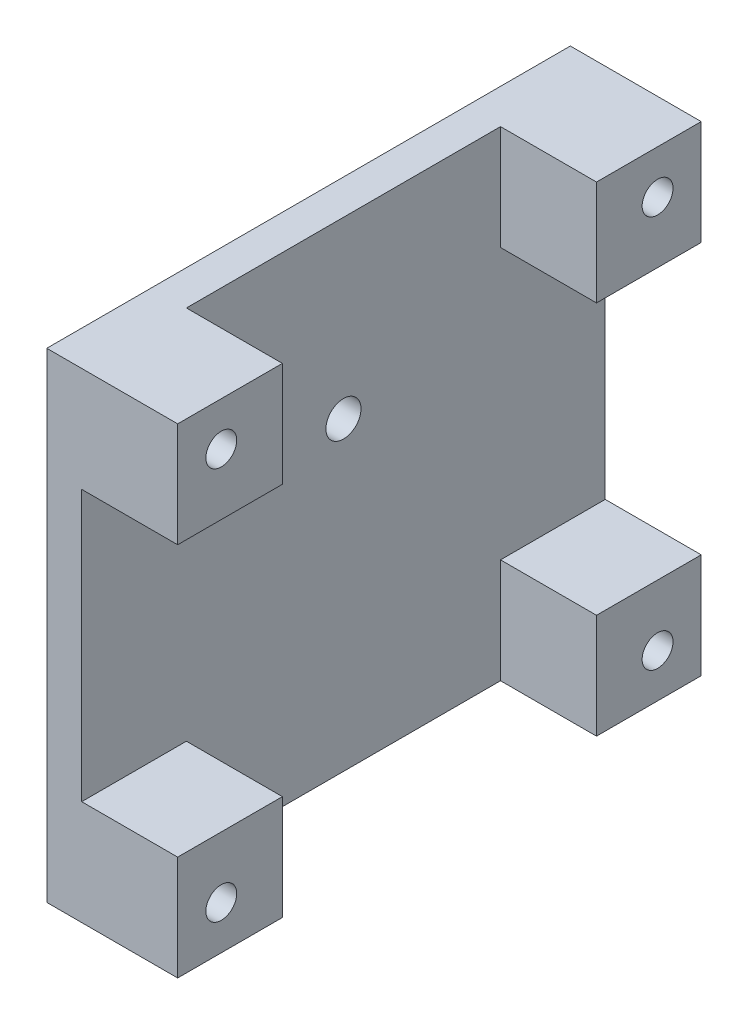
ISO-10303-21;
HEADER;
FILE_DESCRIPTION(('STEP AP214'),'2;1');
FILE_NAME('part.step','',(''),(''),'','','');
FILE_SCHEMA(('AUTOMOTIVE_DESIGN { 1 0 10303 214 1 1 1 1 }'));
ENDSEC;
DATA;
#1=APPLICATION_CONTEXT('core data for automotive mechanical design processes');
#2=APPLICATION_PROTOCOL_DEFINITION('international standard','automotive_design',2000,#1);
#3=PRODUCT_CONTEXT('',#1,'mechanical');
#4=PRODUCT('Part','Part','',(#3));
#5=PRODUCT_RELATED_PRODUCT_CATEGORY('part','',(#4));
#6=PRODUCT_DEFINITION_FORMATION('','',#4);
#7=PRODUCT_DEFINITION_CONTEXT('part definition',#1,'design');
#8=PRODUCT_DEFINITION('design','',#6,#7);
#9=PRODUCT_DEFINITION_SHAPE('','',#8);
#10=(LENGTH_UNIT() NAMED_UNIT(*) SI_UNIT(.MILLI.,.METRE.));
#11=(NAMED_UNIT(*) PLANE_ANGLE_UNIT() SI_UNIT($,.RADIAN.));
#12=(NAMED_UNIT(*) SI_UNIT($,.STERADIAN.) SOLID_ANGLE_UNIT());
#13=UNCERTAINTY_MEASURE_WITH_UNIT(LENGTH_MEASURE(1.E-05),#10,'distance_accuracy_value','');
#14=(GEOMETRIC_REPRESENTATION_CONTEXT(3) GLOBAL_UNCERTAINTY_ASSIGNED_CONTEXT((#13)) GLOBAL_UNIT_ASSIGNED_CONTEXT((#10,
#11,#12)) REPRESENTATION_CONTEXT('',''));
#15=CARTESIAN_POINT('',(0.,0.,0.));
#16=DIRECTION('',(0.,0.,1.));
#17=DIRECTION('',(1.,0.,0.));
#18=AXIS2_PLACEMENT_3D('',#15,#16,#17);
#19=CARTESIAN_POINT('',(19.05,0.,0.));
#20=DIRECTION('',(-1.,0.,0.));
#21=DIRECTION('',(0.,0.,1.));
#22=AXIS2_PLACEMENT_3D('',#19,#20,#21);
#23=PLANE('',#22);
#24=CARTESIAN_POINT('',(19.05,28.575,-31.75));
#25=DIRECTION('',(-1.,0.,0.));
#26=DIRECTION('',(0.,0.,1.));
#27=AXIS2_PLACEMENT_3D('',#24,#25,#26);
#28=CIRCLE('',#27,2.24789999999999);
#29=CARTESIAN_POINT('',(19.05,28.575,-29.5021));
#30=VERTEX_POINT('',#29);
#31=EDGE_CURVE('E597',#30,#30,#28,.T.);
#32=ORIENTED_EDGE('',*,*,#31,.T.);
#33=EDGE_LOOP('',(#32));
#34=FACE_BOUND('',#33,.T.);
#35=DIRECTION('',(0.,0.,1.));
#36=VECTOR('',#35,1.);
#37=CARTESIAN_POINT('',(19.05,34.925,38.1));
#38=LINE('',#37,#36);
#39=CARTESIAN_POINT('',(19.05,34.925,-38.1));
#40=VERTEX_POINT('',#39);
#41=CARTESIAN_POINT('',(19.05,34.925,-22.86));
#42=VERTEX_POINT('',#41);
#43=EDGE_CURVE('E261',#40,#42,#38,.T.);
#44=ORIENTED_EDGE('',*,*,#43,.T.);
#45=DIRECTION('',(0.,1.,0.));
#46=VECTOR('',#45,1.);
#47=CARTESIAN_POINT('',(19.05,19.685,-22.86));
#48=LINE('',#47,#46);
#49=CARTESIAN_POINT('',(19.05,19.685,-22.86));
#50=VERTEX_POINT('',#49);
#51=EDGE_CURVE('E171',#50,#42,#48,.T.);
#52=ORIENTED_EDGE('',*,*,#51,.F.);
#53=DIRECTION('',(0.,0.,1.));
#54=VECTOR('',#53,1.);
#55=CARTESIAN_POINT('',(19.05,19.685,-22.86));
#56=LINE('',#55,#54);
#57=CARTESIAN_POINT('',(19.05,19.685,-38.1));
#58=VERTEX_POINT('',#57);
#59=EDGE_CURVE('E182',#58,#50,#56,.T.);
#60=ORIENTED_EDGE('',*,*,#59,.F.);
#61=DIRECTION('',(0.,1.,0.));
#62=VECTOR('',#61,1.);
#63=CARTESIAN_POINT('',(19.05,-34.925,-38.1));
#64=LINE('',#63,#62);
#65=EDGE_CURVE('E92',#58,#40,#64,.T.);
#66=ORIENTED_EDGE('',*,*,#65,.T.);
#67=EDGE_LOOP('',(#44,#52,#60,#66));
#68=FACE_BOUND('',#67,.T.);
#69=ADVANCED_FACE('F37',(#34,#68),#23,.F.);
#70=CARTESIAN_POINT('',(19.05,-28.575,-31.75));
#71=DIRECTION('',(-1.,0.,0.));
#72=DIRECTION('',(0.,0.,1.));
#73=AXIS2_PLACEMENT_3D('',#70,#71,#72);
#74=CIRCLE('',#73,2.24789999999999);
#75=CARTESIAN_POINT('',(19.05,-28.575,-29.5021));
#76=VERTEX_POINT('',#75);
#77=EDGE_CURVE('E608',#76,#76,#74,.T.);
#78=ORIENTED_EDGE('',*,*,#77,.T.);
#79=EDGE_LOOP('',(#78));
#80=FACE_BOUND('',#79,.T.);
#81=CARTESIAN_POINT('',(19.05,-34.925,-38.1));
#82=VERTEX_POINT('',#81);
#83=CARTESIAN_POINT('',(19.05,-19.685,-38.1));
#84=VERTEX_POINT('',#83);
#85=EDGE_CURVE('E258',#82,#84,#64,.T.);
#86=ORIENTED_EDGE('',*,*,#85,.T.);
#87=DIRECTION('',(0.,0.,-1.));
#88=VECTOR('',#87,1.);
#89=CARTESIAN_POINT('',(19.05,-19.685,-22.86));
#90=LINE('',#89,#88);
#91=CARTESIAN_POINT('',(19.05,-19.685,-22.86));
#92=VERTEX_POINT('',#91);
#93=EDGE_CURVE('E229',#92,#84,#90,.T.);
#94=ORIENTED_EDGE('',*,*,#93,.F.);
#95=DIRECTION('',(0.,1.,0.));
#96=VECTOR('',#95,1.);
#97=CARTESIAN_POINT('',(19.05,-34.925,-22.86));
#98=LINE('',#97,#96);
#99=CARTESIAN_POINT('',(19.05,-34.925,-22.86));
#100=VERTEX_POINT('',#99);
#101=EDGE_CURVE('E226',#100,#92,#98,.T.);
#102=ORIENTED_EDGE('',*,*,#101,.F.);
#103=DIRECTION('',(0.,0.,-1.));
#104=VECTOR('',#103,1.);
#105=CARTESIAN_POINT('',(19.05,-34.925,38.1));
#106=LINE('',#105,#104);
#107=EDGE_CURVE('E62',#100,#82,#106,.T.);
#108=ORIENTED_EDGE('',*,*,#107,.T.);
#109=EDGE_LOOP('',(#86,#94,#102,#108));
#110=FACE_BOUND('',#109,.T.);
#111=ADVANCED_FACE('F301',(#80,#110),#23,.F.);
#112=CARTESIAN_POINT('',(19.05,-28.575,31.75));
#113=DIRECTION('',(-1.,0.,0.));
#114=DIRECTION('',(0.,0.,1.));
#115=AXIS2_PLACEMENT_3D('',#112,#113,#114);
#116=CIRCLE('',#115,2.24789999999999);
#117=CARTESIAN_POINT('',(19.05,-28.575,33.9979));
#118=VERTEX_POINT('',#117);
#119=EDGE_CURVE('E217',#118,#118,#116,.T.);
#120=ORIENTED_EDGE('',*,*,#119,.T.);
#121=EDGE_LOOP('',(#120));
#122=FACE_BOUND('',#121,.T.);
#123=CARTESIAN_POINT('',(19.05,-34.925,38.1));
#124=VERTEX_POINT('',#123);
#125=CARTESIAN_POINT('',(19.05,-34.925,22.86));
#126=VERTEX_POINT('',#125);
#127=EDGE_CURVE('E267',#124,#126,#106,.T.);
#128=ORIENTED_EDGE('',*,*,#127,.T.);
#129=DIRECTION('',(0.,-1.,0.));
#130=VECTOR('',#129,1.);
#131=CARTESIAN_POINT('',(19.05,-34.925,22.86));
#132=LINE('',#131,#130);
#133=CARTESIAN_POINT('',(19.05,-19.685,22.86));
#134=VERTEX_POINT('',#133);
#135=EDGE_CURVE('E224',#134,#126,#132,.T.);
#136=ORIENTED_EDGE('',*,*,#135,.F.);
#137=DIRECTION('',(0.,0.,-1.));
#138=VECTOR('',#137,1.);
#139=CARTESIAN_POINT('',(19.05,-19.685,38.1));
#140=LINE('',#139,#138);
#141=CARTESIAN_POINT('',(19.05,-19.685,38.1));
#142=VERTEX_POINT('',#141);
#143=EDGE_CURVE('E221',#142,#134,#140,.T.);
#144=ORIENTED_EDGE('',*,*,#143,.F.);
#145=DIRECTION('',(0.,-1.,0.));
#146=VECTOR('',#145,1.);
#147=CARTESIAN_POINT('',(19.05,-34.925,38.1));
#148=LINE('',#147,#146);
#149=EDGE_CURVE('E263',#142,#124,#148,.T.);
#150=ORIENTED_EDGE('',*,*,#149,.T.);
#151=EDGE_LOOP('',(#128,#136,#144,#150));
#152=FACE_BOUND('',#151,.T.);
#153=ADVANCED_FACE('F316',(#122,#152),#23,.F.);
#154=CARTESIAN_POINT('',(19.05,-34.925,-38.1));
#155=DIRECTION('',(0.,0.,1.));
#156=DIRECTION('',(1.,0.,0.));
#157=AXIS2_PLACEMENT_3D('',#154,#155,#156);
#158=PLANE('',#157);
#159=ORIENTED_EDGE('',*,*,#65,.F.);
#160=DIRECTION('',(1.,0.,0.));
#161=VECTOR('',#160,1.);
#162=CARTESIAN_POINT('',(5.08,19.685,-38.1));
#163=LINE('',#162,#161);
#164=CARTESIAN_POINT('',(5.08,19.685,-38.1));
#165=VERTEX_POINT('',#164);
#166=EDGE_CURVE('E236',#165,#58,#163,.T.);
#167=ORIENTED_EDGE('',*,*,#166,.F.);
#168=DIRECTION('',(0.,1.,0.));
#169=VECTOR('',#168,1.);
#170=CARTESIAN_POINT('',(5.08,19.685,-38.1));
#171=LINE('',#170,#169);
#172=CARTESIAN_POINT('',(5.08,-19.685,-38.1));
#173=VERTEX_POINT('',#172);
#174=EDGE_CURVE('E212',#173,#165,#171,.T.);
#175=ORIENTED_EDGE('',*,*,#174,.F.);
#176=DIRECTION('',(1.,0.,0.));
#177=VECTOR('',#176,1.);
#178=CARTESIAN_POINT('',(5.08,-19.685,-38.1));
#179=LINE('',#178,#177);
#180=EDGE_CURVE('E238',#173,#84,#179,.T.);
#181=ORIENTED_EDGE('',*,*,#180,.T.);
#182=ORIENTED_EDGE('',*,*,#85,.F.);
#183=DIRECTION('',(-1.,0.,0.));
#184=VECTOR('',#183,1.);
#185=CARTESIAN_POINT('',(19.05,-34.925,-38.1));
#186=LINE('',#185,#184);
#187=CARTESIAN_POINT('',(0.,-34.925,-38.1));
#188=VERTEX_POINT('',#187);
#189=EDGE_CURVE('E270',#82,#188,#186,.T.);
#190=ORIENTED_EDGE('',*,*,#189,.T.);
#191=DIRECTION('',(0.,1.,0.));
#192=VECTOR('',#191,1.);
#193=CARTESIAN_POINT('',(0.,-34.925,-38.1));
#194=LINE('',#193,#192);
#195=CARTESIAN_POINT('',(0.,34.925,-38.1));
#196=VERTEX_POINT('',#195);
#197=EDGE_CURVE('E235',#188,#196,#194,.T.);
#198=ORIENTED_EDGE('',*,*,#197,.T.);
#199=DIRECTION('',(-1.,0.,0.));
#200=VECTOR('',#199,1.);
#201=CARTESIAN_POINT('',(19.05,34.925,-38.1));
#202=LINE('',#201,#200);
#203=EDGE_CURVE('E11',#40,#196,#202,.T.);
#204=ORIENTED_EDGE('',*,*,#203,.F.);
#205=EDGE_LOOP('',(#159,#167,#175,#181,#182,#190,#198,#204));
#206=FACE_BOUND('',#205,.T.);
#207=ADVANCED_FACE('F39',(#206),#158,.F.);
#208=CARTESIAN_POINT('',(19.05,34.925,38.1));
#209=DIRECTION('',(0.,-1.,0.));
#210=DIRECTION('',(0.,0.,-1.));
#211=AXIS2_PLACEMENT_3D('',#208,#209,#210);
#212=PLANE('',#211);
#213=DIRECTION('',(0.,0.,1.));
#214=VECTOR('',#213,1.);
#215=CARTESIAN_POINT('',(5.08,34.925,22.86));
#216=LINE('',#215,#214);
#217=CARTESIAN_POINT('',(5.08,34.925,-22.86));
#218=VERTEX_POINT('',#217);
#219=CARTESIAN_POINT('',(5.08,34.925,22.86));
#220=VERTEX_POINT('',#219);
#221=EDGE_CURVE('E180',#218,#220,#216,.T.);
#222=ORIENTED_EDGE('',*,*,#221,.F.);
#223=DIRECTION('',(1.,0.,0.));
#224=VECTOR('',#223,1.);
#225=CARTESIAN_POINT('',(5.08,34.925,-22.86));
#226=LINE('',#225,#224);
#227=EDGE_CURVE('E165',#218,#42,#226,.T.);
#228=ORIENTED_EDGE('',*,*,#227,.T.);
#229=ORIENTED_EDGE('',*,*,#43,.F.);
#230=ORIENTED_EDGE('',*,*,#203,.T.);
#231=DIRECTION('',(0.,0.,1.));
#232=VECTOR('',#231,1.);
#233=CARTESIAN_POINT('',(0.,34.925,38.1));
#234=LINE('',#233,#232);
#235=CARTESIAN_POINT('',(0.,34.925,38.1));
#236=VERTEX_POINT('',#235);
#237=EDGE_CURVE('E273',#196,#236,#234,.T.);
#238=ORIENTED_EDGE('',*,*,#237,.T.);
#239=DIRECTION('',(-1.,0.,0.));
#240=VECTOR('',#239,1.);
#241=CARTESIAN_POINT('',(19.05,34.925,38.1));
#242=LINE('',#241,#240);
#243=CARTESIAN_POINT('',(19.05,34.925,38.1));
#244=VERTEX_POINT('',#243);
#245=EDGE_CURVE('E46',#244,#236,#242,.T.);
#246=ORIENTED_EDGE('',*,*,#245,.F.);
#247=CARTESIAN_POINT('',(19.05,34.925,22.86));
#248=VERTEX_POINT('',#247);
#249=EDGE_CURVE('E260',#248,#244,#38,.T.);
#250=ORIENTED_EDGE('',*,*,#249,.F.);
#251=DIRECTION('',(1.,0.,0.));
#252=VECTOR('',#251,1.);
#253=CARTESIAN_POINT('',(5.08,34.925,22.86));
#254=LINE('',#253,#252);
#255=EDGE_CURVE('E53',#220,#248,#254,.T.);
#256=ORIENTED_EDGE('',*,*,#255,.F.);
#257=EDGE_LOOP('',(#222,#228,#229,#230,#238,#246,#250,#256));
#258=FACE_BOUND('',#257,.T.);
#259=ADVANCED_FACE('F184',(#258),#212,.F.);
#260=CARTESIAN_POINT('',(19.05,-34.925,38.1));
#261=DIRECTION('',(0.,0.,-1.));
#262=DIRECTION('',(-1.,0.,0.));
#263=AXIS2_PLACEMENT_3D('',#260,#261,#262);
#264=PLANE('',#263);
#265=ORIENTED_EDGE('',*,*,#149,.F.);
#266=DIRECTION('',(1.,0.,0.));
#267=VECTOR('',#266,1.);
#268=CARTESIAN_POINT('',(5.08,-19.685,38.1));
#269=LINE('',#268,#267);
#270=CARTESIAN_POINT('',(5.08,-19.685,38.1));
#271=VERTEX_POINT('',#270);
#272=EDGE_CURVE('E250',#271,#142,#269,.T.);
#273=ORIENTED_EDGE('',*,*,#272,.F.);
#274=DIRECTION('',(0.,-1.,0.));
#275=VECTOR('',#274,1.);
#276=CARTESIAN_POINT('',(5.08,19.685,38.1));
#277=LINE('',#276,#275);
#278=CARTESIAN_POINT('',(5.08,19.685,38.1));
#279=VERTEX_POINT('',#278);
#280=EDGE_CURVE('E194',#279,#271,#277,.T.);
#281=ORIENTED_EDGE('',*,*,#280,.F.);
#282=DIRECTION('',(1.,0.,0.));
#283=VECTOR('',#282,1.);
#284=CARTESIAN_POINT('',(5.08,19.685,38.1));
#285=LINE('',#284,#283);
#286=CARTESIAN_POINT('',(19.05,19.685,38.1));
#287=VERTEX_POINT('',#286);
#288=EDGE_CURVE('E252',#279,#287,#285,.T.);
#289=ORIENTED_EDGE('',*,*,#288,.T.);
#290=EDGE_CURVE('E264',#244,#287,#148,.T.);
#291=ORIENTED_EDGE('',*,*,#290,.F.);
#292=ORIENTED_EDGE('',*,*,#245,.T.);
#293=DIRECTION('',(0.,-1.,0.));
#294=VECTOR('',#293,1.);
#295=CARTESIAN_POINT('',(0.,-34.925,38.1));
#296=LINE('',#295,#294);
#297=CARTESIAN_POINT('',(0.,-34.925,38.1));
#298=VERTEX_POINT('',#297);
#299=EDGE_CURVE('E275',#236,#298,#296,.T.);
#300=ORIENTED_EDGE('',*,*,#299,.T.);
#301=DIRECTION('',(-1.,0.,0.));
#302=VECTOR('',#301,1.);
#303=CARTESIAN_POINT('',(19.05,-34.925,38.1));
#304=LINE('',#303,#302);
#305=EDGE_CURVE('E279',#124,#298,#304,.T.);
#306=ORIENTED_EDGE('',*,*,#305,.F.);
#307=EDGE_LOOP('',(#265,#273,#281,#289,#291,#292,#300,#306));
#308=FACE_BOUND('',#307,.T.);
#309=ADVANCED_FACE('F287',(#308),#264,.F.);
#310=CARTESIAN_POINT('',(19.05,-34.925,38.1));
#311=DIRECTION('',(0.,1.,0.));
#312=DIRECTION('',(0.,0.,1.));
#313=AXIS2_PLACEMENT_3D('',#310,#311,#312);
#314=PLANE('',#313);
#315=ORIENTED_EDGE('',*,*,#107,.F.);
#316=DIRECTION('',(1.,0.,0.));
#317=VECTOR('',#316,1.);
#318=CARTESIAN_POINT('',(5.08,-34.925,-22.86));
#319=LINE('',#318,#317);
#320=CARTESIAN_POINT('',(5.08,-34.925,-22.86));
#321=VERTEX_POINT('',#320);
#322=EDGE_CURVE('E243',#321,#100,#319,.T.);
#323=ORIENTED_EDGE('',*,*,#322,.F.);
#324=DIRECTION('',(0.,0.,-1.));
#325=VECTOR('',#324,1.);
#326=CARTESIAN_POINT('',(5.08,-34.925,22.86));
#327=LINE('',#326,#325);
#328=CARTESIAN_POINT('',(5.08,-34.925,22.86));
#329=VERTEX_POINT('',#328);
#330=EDGE_CURVE('E203',#329,#321,#327,.T.);
#331=ORIENTED_EDGE('',*,*,#330,.F.);
#332=DIRECTION('',(1.,0.,0.));
#333=VECTOR('',#332,1.);
#334=CARTESIAN_POINT('',(5.08,-34.925,22.86));
#335=LINE('',#334,#333);
#336=EDGE_CURVE('E245',#329,#126,#335,.T.);
#337=ORIENTED_EDGE('',*,*,#336,.T.);
#338=ORIENTED_EDGE('',*,*,#127,.F.);
#339=ORIENTED_EDGE('',*,*,#305,.T.);
#340=DIRECTION('',(0.,0.,-1.));
#341=VECTOR('',#340,1.);
#342=CARTESIAN_POINT('',(0.,-34.925,38.1));
#343=LINE('',#342,#341);
#344=EDGE_CURVE('E84',#298,#188,#343,.T.);
#345=ORIENTED_EDGE('',*,*,#344,.T.);
#346=ORIENTED_EDGE('',*,*,#189,.F.);
#347=EDGE_LOOP('',(#315,#323,#331,#337,#338,#339,#345,#346));
#348=FACE_BOUND('',#347,.T.);
#349=ADVANCED_FACE('F295',(#348),#314,.F.);
#350=CARTESIAN_POINT('',(19.05,28.575,31.75));
#351=DIRECTION('',(-1.,0.,0.));
#352=DIRECTION('',(0.,0.,1.));
#353=AXIS2_PLACEMENT_3D('',#350,#351,#352);
#354=CIRCLE('',#353,2.24789999999999);
#355=CARTESIAN_POINT('',(19.05,28.575,33.9979));
#356=VERTEX_POINT('',#355);
#357=EDGE_CURVE('E586',#356,#356,#354,.T.);
#358=ORIENTED_EDGE('',*,*,#357,.T.);
#359=EDGE_LOOP('',(#358));
#360=FACE_BOUND('',#359,.T.);
#361=ORIENTED_EDGE('',*,*,#290,.T.);
#362=DIRECTION('',(0.,0.,1.));
#363=VECTOR('',#362,1.);
#364=CARTESIAN_POINT('',(19.05,19.685,38.1));
#365=LINE('',#364,#363);
#366=CARTESIAN_POINT('',(19.05,19.685,22.86));
#367=VERTEX_POINT('',#366);
#368=EDGE_CURVE('E219',#367,#287,#365,.T.);
#369=ORIENTED_EDGE('',*,*,#368,.F.);
#370=DIRECTION('',(0.,-1.,0.));
#371=VECTOR('',#370,1.);
#372=CARTESIAN_POINT('',(19.05,19.685,22.86));
#373=LINE('',#372,#371);
#374=EDGE_CURVE('E216',#248,#367,#373,.T.);
#375=ORIENTED_EDGE('',*,*,#374,.F.);
#376=ORIENTED_EDGE('',*,*,#249,.T.);
#377=EDGE_LOOP('',(#361,#369,#375,#376));
#378=FACE_BOUND('',#377,.T.);
#379=ADVANCED_FACE('F312',(#360,#378),#23,.F.);
#380=CARTESIAN_POINT('',(0.,0.,0.));
#381=DIRECTION('',(-1.,0.,0.));
#382=DIRECTION('',(0.,0.,1.));
#383=AXIS2_PLACEMENT_3D('',#380,#381,#382);
#384=PLANE('',#383);
#385=CARTESIAN_POINT('',(0.,9.525,0.));
#386=DIRECTION('',(-1.,0.,0.));
#387=DIRECTION('',(0.,0.,1.));
#388=AXIS2_PLACEMENT_3D('',#385,#386,#387);
#389=CIRCLE('',#388,2.55269999999999);
#390=CARTESIAN_POINT('',(0.,9.525,2.55269999999999));
#391=VERTEX_POINT('',#390);
#392=EDGE_CURVE('E41',#391,#391,#389,.T.);
#393=ORIENTED_EDGE('',*,*,#392,.F.);
#394=EDGE_LOOP('',(#393));
#395=FACE_BOUND('',#394,.T.);
#396=CARTESIAN_POINT('',(0.,28.575,31.75));
#397=DIRECTION('',(-1.,0.,0.));
#398=DIRECTION('',(0.,0.,1.));
#399=AXIS2_PLACEMENT_3D('',#396,#397,#398);
#400=CIRCLE('',#399,3.96875);
#401=CARTESIAN_POINT('',(0.,28.575,35.71875));
#402=VERTEX_POINT('',#401);
#403=EDGE_CURVE('E576',#402,#402,#400,.T.);
#404=ORIENTED_EDGE('',*,*,#403,.F.);
#405=EDGE_LOOP('',(#404));
#406=FACE_BOUND('',#405,.T.);
#407=CARTESIAN_POINT('',(0.,28.575,-31.75));
#408=DIRECTION('',(-1.,0.,0.));
#409=DIRECTION('',(0.,0.,1.));
#410=AXIS2_PLACEMENT_3D('',#407,#408,#409);
#411=CIRCLE('',#410,3.96875);
#412=CARTESIAN_POINT('',(0.,28.575,-27.78125));
#413=VERTEX_POINT('',#412);
#414=EDGE_CURVE('E588',#413,#413,#411,.T.);
#415=ORIENTED_EDGE('',*,*,#414,.F.);
#416=EDGE_LOOP('',(#415));
#417=FACE_BOUND('',#416,.T.);
#418=CARTESIAN_POINT('',(0.,-28.575,-31.75));
#419=DIRECTION('',(-1.,0.,0.));
#420=DIRECTION('',(0.,0.,1.));
#421=AXIS2_PLACEMENT_3D('',#418,#419,#420);
#422=CIRCLE('',#421,3.96875);
#423=CARTESIAN_POINT('',(0.,-28.575,-27.78125));
#424=VERTEX_POINT('',#423);
#425=EDGE_CURVE('E599',#424,#424,#422,.T.);
#426=ORIENTED_EDGE('',*,*,#425,.F.);
#427=EDGE_LOOP('',(#426));
#428=FACE_BOUND('',#427,.T.);
#429=CARTESIAN_POINT('',(0.,-28.575,31.75));
#430=DIRECTION('',(-1.,0.,0.));
#431=DIRECTION('',(0.,0.,1.));
#432=AXIS2_PLACEMENT_3D('',#429,#430,#431);
#433=CIRCLE('',#432,3.96875);
#434=CARTESIAN_POINT('',(0.,-28.575,35.71875));
#435=VERTEX_POINT('',#434);
#436=EDGE_CURVE('E611',#435,#435,#433,.T.);
#437=ORIENTED_EDGE('',*,*,#436,.F.);
#438=EDGE_LOOP('',(#437));
#439=FACE_BOUND('',#438,.T.);
#440=ORIENTED_EDGE('',*,*,#197,.F.);
#441=ORIENTED_EDGE('',*,*,#344,.F.);
#442=ORIENTED_EDGE('',*,*,#299,.F.);
#443=ORIENTED_EDGE('',*,*,#237,.F.);
#444=EDGE_LOOP('',(#440,#441,#442,#443));
#445=FACE_BOUND('',#444,.T.);
#446=ADVANCED_FACE('F291',(#395,#406,#417,#428,#439,#445),#384,.T.);
#447=CARTESIAN_POINT('',(5.08,19.685,-22.86));
#448=DIRECTION('',(0.,0.,-1.));
#449=DIRECTION('',(-1.,0.,0.));
#450=AXIS2_PLACEMENT_3D('',#447,#448,#449);
#451=PLANE('',#450);
#452=ORIENTED_EDGE('',*,*,#51,.T.);
#453=ORIENTED_EDGE('',*,*,#227,.F.);
#454=DIRECTION('',(0.,1.,0.));
#455=VECTOR('',#454,1.);
#456=CARTESIAN_POINT('',(5.08,19.685,-22.86));
#457=LINE('',#456,#455);
#458=CARTESIAN_POINT('',(5.08,19.685,-22.86));
#459=VERTEX_POINT('',#458);
#460=EDGE_CURVE('E168',#459,#218,#457,.T.);
#461=ORIENTED_EDGE('',*,*,#460,.F.);
#462=DIRECTION('',(1.,0.,0.));
#463=VECTOR('',#462,1.);
#464=CARTESIAN_POINT('',(5.08,19.685,-22.86));
#465=LINE('',#464,#463);
#466=EDGE_CURVE('E233',#459,#50,#465,.T.);
#467=ORIENTED_EDGE('',*,*,#466,.T.);
#468=EDGE_LOOP('',(#452,#453,#461,#467));
#469=FACE_BOUND('',#468,.T.);
#470=ADVANCED_FACE('F167',(#469),#451,.F.);
#471=CARTESIAN_POINT('',(5.08,19.685,-22.86));
#472=DIRECTION('',(0.,1.,0.));
#473=DIRECTION('',(0.,0.,1.));
#474=AXIS2_PLACEMENT_3D('',#471,#472,#473);
#475=PLANE('',#474);
#476=ORIENTED_EDGE('',*,*,#59,.T.);
#477=ORIENTED_EDGE('',*,*,#466,.F.);
#478=DIRECTION('',(0.,0.,1.));
#479=VECTOR('',#478,1.);
#480=CARTESIAN_POINT('',(5.08,19.685,-22.86));
#481=LINE('',#480,#479);
#482=EDGE_CURVE('E174',#165,#459,#481,.T.);
#483=ORIENTED_EDGE('',*,*,#482,.F.);
#484=ORIENTED_EDGE('',*,*,#166,.T.);
#485=EDGE_LOOP('',(#476,#477,#483,#484));
#486=FACE_BOUND('',#485,.T.);
#487=ADVANCED_FACE('F308',(#486),#475,.F.);
#488=CARTESIAN_POINT('',(5.08,-19.685,-22.86));
#489=DIRECTION('',(0.,-1.,0.));
#490=DIRECTION('',(0.,0.,-1.));
#491=AXIS2_PLACEMENT_3D('',#488,#489,#490);
#492=PLANE('',#491);
#493=ORIENTED_EDGE('',*,*,#93,.T.);
#494=ORIENTED_EDGE('',*,*,#180,.F.);
#495=DIRECTION('',(0.,0.,-1.));
#496=VECTOR('',#495,1.);
#497=CARTESIAN_POINT('',(5.08,-19.685,-22.86));
#498=LINE('',#497,#496);
#499=CARTESIAN_POINT('',(5.08,-19.685,-22.86));
#500=VERTEX_POINT('',#499);
#501=EDGE_CURVE('E209',#500,#173,#498,.T.);
#502=ORIENTED_EDGE('',*,*,#501,.F.);
#503=DIRECTION('',(1.,0.,0.));
#504=VECTOR('',#503,1.);
#505=CARTESIAN_POINT('',(5.08,-19.685,-22.86));
#506=LINE('',#505,#504);
#507=EDGE_CURVE('E241',#500,#92,#506,.T.);
#508=ORIENTED_EDGE('',*,*,#507,.T.);
#509=EDGE_LOOP('',(#493,#494,#502,#508));
#510=FACE_BOUND('',#509,.T.);
#511=ADVANCED_FACE('F303',(#510),#492,.F.);
#512=CARTESIAN_POINT('',(5.08,-34.925,-22.86));
#513=DIRECTION('',(0.,0.,-1.));
#514=DIRECTION('',(-1.,0.,0.));
#515=AXIS2_PLACEMENT_3D('',#512,#513,#514);
#516=PLANE('',#515);
#517=ORIENTED_EDGE('',*,*,#101,.T.);
#518=ORIENTED_EDGE('',*,*,#507,.F.);
#519=DIRECTION('',(0.,1.,0.));
#520=VECTOR('',#519,1.);
#521=CARTESIAN_POINT('',(5.08,-34.925,-22.86));
#522=LINE('',#521,#520);
#523=EDGE_CURVE('E206',#321,#500,#522,.T.);
#524=ORIENTED_EDGE('',*,*,#523,.F.);
#525=ORIENTED_EDGE('',*,*,#322,.T.);
#526=EDGE_LOOP('',(#517,#518,#524,#525));
#527=FACE_BOUND('',#526,.T.);
#528=ADVANCED_FACE('F299',(#527),#516,.F.);
#529=CARTESIAN_POINT('',(5.08,-34.925,22.86));
#530=DIRECTION('',(0.,0.,1.));
#531=DIRECTION('',(1.,0.,0.));
#532=AXIS2_PLACEMENT_3D('',#529,#530,#531);
#533=PLANE('',#532);
#534=ORIENTED_EDGE('',*,*,#135,.T.);
#535=ORIENTED_EDGE('',*,*,#336,.F.);
#536=DIRECTION('',(0.,-1.,0.));
#537=VECTOR('',#536,1.);
#538=CARTESIAN_POINT('',(5.08,-34.925,22.86));
#539=LINE('',#538,#537);
#540=CARTESIAN_POINT('',(5.08,-19.685,22.86));
#541=VERTEX_POINT('',#540);
#542=EDGE_CURVE('E200',#541,#329,#539,.T.);
#543=ORIENTED_EDGE('',*,*,#542,.F.);
#544=DIRECTION('',(1.,0.,0.));
#545=VECTOR('',#544,1.);
#546=CARTESIAN_POINT('',(5.08,-19.685,22.86));
#547=LINE('',#546,#545);
#548=EDGE_CURVE('E248',#541,#134,#547,.T.);
#549=ORIENTED_EDGE('',*,*,#548,.T.);
#550=EDGE_LOOP('',(#534,#535,#543,#549));
#551=FACE_BOUND('',#550,.T.);
#552=ADVANCED_FACE('F344',(#551),#533,.F.);
#553=CARTESIAN_POINT('',(5.08,-19.685,38.1));
#554=DIRECTION('',(0.,-1.,0.));
#555=DIRECTION('',(0.,0.,-1.));
#556=AXIS2_PLACEMENT_3D('',#553,#554,#555);
#557=PLANE('',#556);
#558=ORIENTED_EDGE('',*,*,#143,.T.);
#559=ORIENTED_EDGE('',*,*,#548,.F.);
#560=DIRECTION('',(0.,0.,-1.));
#561=VECTOR('',#560,1.);
#562=CARTESIAN_POINT('',(5.08,-19.685,38.1));
#563=LINE('',#562,#561);
#564=EDGE_CURVE('E197',#271,#541,#563,.T.);
#565=ORIENTED_EDGE('',*,*,#564,.F.);
#566=ORIENTED_EDGE('',*,*,#272,.T.);
#567=EDGE_LOOP('',(#558,#559,#565,#566));
#568=FACE_BOUND('',#567,.T.);
#569=ADVANCED_FACE('F348',(#568),#557,.F.);
#570=CARTESIAN_POINT('',(5.08,19.685,38.1));
#571=DIRECTION('',(0.,1.,0.));
#572=DIRECTION('',(0.,0.,1.));
#573=AXIS2_PLACEMENT_3D('',#570,#571,#572);
#574=PLANE('',#573);
#575=ORIENTED_EDGE('',*,*,#368,.T.);
#576=ORIENTED_EDGE('',*,*,#288,.F.);
#577=DIRECTION('',(0.,0.,1.));
#578=VECTOR('',#577,1.);
#579=CARTESIAN_POINT('',(5.08,19.685,38.1));
#580=LINE('',#579,#578);
#581=CARTESIAN_POINT('',(5.08,19.685,22.86));
#582=VERTEX_POINT('',#581);
#583=EDGE_CURVE('E188',#582,#279,#580,.T.);
#584=ORIENTED_EDGE('',*,*,#583,.F.);
#585=DIRECTION('',(1.,0.,0.));
#586=VECTOR('',#585,1.);
#587=CARTESIAN_POINT('',(5.08,19.685,22.86));
#588=LINE('',#587,#586);
#589=EDGE_CURVE('E255',#582,#367,#588,.T.);
#590=ORIENTED_EDGE('',*,*,#589,.T.);
#591=EDGE_LOOP('',(#575,#576,#584,#590));
#592=FACE_BOUND('',#591,.T.);
#593=ADVANCED_FACE('F353',(#592),#574,.F.);
#594=CARTESIAN_POINT('',(5.08,19.685,22.86));
#595=DIRECTION('',(0.,0.,1.));
#596=DIRECTION('',(0.,-1.,0.));
#597=AXIS2_PLACEMENT_3D('',#594,#595,#596);
#598=PLANE('',#597);
#599=ORIENTED_EDGE('',*,*,#374,.T.);
#600=ORIENTED_EDGE('',*,*,#589,.F.);
#601=DIRECTION('',(0.,-1.,0.));
#602=VECTOR('',#601,1.);
#603=CARTESIAN_POINT('',(5.08,19.685,22.86));
#604=LINE('',#603,#602);
#605=EDGE_CURVE('E186',#220,#582,#604,.T.);
#606=ORIENTED_EDGE('',*,*,#605,.F.);
#607=ORIENTED_EDGE('',*,*,#255,.T.);
#608=EDGE_LOOP('',(#599,#600,#606,#607));
#609=FACE_BOUND('',#608,.T.);
#610=ADVANCED_FACE('F352',(#609),#598,.F.);
#611=CARTESIAN_POINT('',(5.08,0.,0.));
#612=DIRECTION('',(-1.,0.,0.));
#613=DIRECTION('',(0.,0.,1.));
#614=AXIS2_PLACEMENT_3D('',#611,#612,#613);
#615=PLANE('',#614);
#616=CARTESIAN_POINT('',(5.08,9.525,0.));
#617=DIRECTION('',(1.,0.,0.));
#618=DIRECTION('',(0.,0.,-1.));
#619=AXIS2_PLACEMENT_3D('',#616,#617,#618);
#620=CIRCLE('',#619,2.55269999999999);
#621=CARTESIAN_POINT('',(5.08,9.525,-2.55269999999999));
#622=VERTEX_POINT('',#621);
#623=EDGE_CURVE('E574',#622,#622,#620,.T.);
#624=ORIENTED_EDGE('',*,*,#623,.F.);
#625=EDGE_LOOP('',(#624));
#626=FACE_BOUND('',#625,.T.);
#627=ORIENTED_EDGE('',*,*,#460,.T.);
#628=ORIENTED_EDGE('',*,*,#221,.T.);
#629=ORIENTED_EDGE('',*,*,#605,.T.);
#630=ORIENTED_EDGE('',*,*,#583,.T.);
#631=ORIENTED_EDGE('',*,*,#280,.T.);
#632=ORIENTED_EDGE('',*,*,#564,.T.);
#633=ORIENTED_EDGE('',*,*,#542,.T.);
#634=ORIENTED_EDGE('',*,*,#330,.T.);
#635=ORIENTED_EDGE('',*,*,#523,.T.);
#636=ORIENTED_EDGE('',*,*,#501,.T.);
#637=ORIENTED_EDGE('',*,*,#174,.T.);
#638=ORIENTED_EDGE('',*,*,#482,.T.);
#639=EDGE_LOOP('',(#627,#628,#629,#630,#631,#632,#633,#634,#635,#636,#637,#638));
#640=FACE_BOUND('',#639,.T.);
#641=ADVANCED_FACE('F178',(#626,#640),#615,.F.);
#642=CARTESIAN_POINT('',(0.,-28.575,31.75));
#643=DIRECTION('',(-1.,0.,0.));
#644=DIRECTION('',(0.,0.,1.));
#645=AXIS2_PLACEMENT_3D('',#642,#643,#644);
#646=CYLINDRICAL_SURFACE('',#645,2.2479);
#647=ORIENTED_EDGE('',*,*,#119,.F.);
#648=EDGE_LOOP('',(#647));
#649=FACE_BOUND('',#648,.T.);
#650=CARTESIAN_POINT('',(4.1656,-28.575,31.75));
#651=DIRECTION('',(-1.,0.,0.));
#652=DIRECTION('',(0.,0.,1.));
#653=AXIS2_PLACEMENT_3D('',#650,#651,#652);
#654=CIRCLE('',#653,2.2479);
#655=CARTESIAN_POINT('',(4.1656,-28.575,33.9979));
#656=VERTEX_POINT('',#655);
#657=EDGE_CURVE('E617',#656,#656,#654,.T.);
#658=ORIENTED_EDGE('',*,*,#657,.T.);
#659=EDGE_LOOP('',(#658));
#660=FACE_BOUND('',#659,.T.);
#661=ADVANCED_FACE('F423',(#649,#660),#646,.F.);
#662=CARTESIAN_POINT('',(4.1656,-26.3271,31.75));
#663=DIRECTION('',(1.,0.,0.));
#664=DIRECTION('',(0.,0.,-1.));
#665=AXIS2_PLACEMENT_3D('',#662,#663,#664);
#666=PLANE('',#665);
#667=ORIENTED_EDGE('',*,*,#657,.F.);
#668=EDGE_LOOP('',(#667));
#669=FACE_BOUND('',#668,.T.);
#670=CARTESIAN_POINT('',(4.1656,-28.575,31.75));
#671=DIRECTION('',(-1.,0.,0.));
#672=DIRECTION('',(0.,0.,1.));
#673=AXIS2_PLACEMENT_3D('',#670,#671,#672);
#674=CIRCLE('',#673,3.96875);
#675=CARTESIAN_POINT('',(4.1656,-28.575,35.71875));
#676=VERTEX_POINT('',#675);
#677=EDGE_CURVE('E614',#676,#676,#674,.T.);
#678=ORIENTED_EDGE('',*,*,#677,.T.);
#679=EDGE_LOOP('',(#678));
#680=FACE_BOUND('',#679,.T.);
#681=ADVANCED_FACE('F428',(#669,#680),#666,.F.);
#682=CARTESIAN_POINT('',(0.,-28.575,31.75));
#683=DIRECTION('',(-1.,0.,0.));
#684=DIRECTION('',(0.,0.,1.));
#685=AXIS2_PLACEMENT_3D('',#682,#683,#684);
#686=CYLINDRICAL_SURFACE('',#685,3.96875);
#687=ORIENTED_EDGE('',*,*,#677,.F.);
#688=EDGE_LOOP('',(#687));
#689=FACE_BOUND('',#688,.T.);
#690=ORIENTED_EDGE('',*,*,#436,.T.);
#691=EDGE_LOOP('',(#690));
#692=FACE_BOUND('',#691,.T.);
#693=ADVANCED_FACE('F437',(#689,#692),#686,.F.);
#694=CARTESIAN_POINT('',(0.,-28.575,-31.75));
#695=DIRECTION('',(-1.,0.,0.));
#696=DIRECTION('',(0.,0.,1.));
#697=AXIS2_PLACEMENT_3D('',#694,#695,#696);
#698=CYLINDRICAL_SURFACE('',#697,2.2479);
#699=ORIENTED_EDGE('',*,*,#77,.F.);
#700=EDGE_LOOP('',(#699));
#701=FACE_BOUND('',#700,.T.);
#702=CARTESIAN_POINT('',(4.1656,-28.575,-31.75));
#703=DIRECTION('',(-1.,0.,0.));
#704=DIRECTION('',(0.,0.,1.));
#705=AXIS2_PLACEMENT_3D('',#702,#703,#704);
#706=CIRCLE('',#705,2.2479);
#707=CARTESIAN_POINT('',(4.1656,-28.575,-29.5021));
#708=VERTEX_POINT('',#707);
#709=EDGE_CURVE('E605',#708,#708,#706,.T.);
#710=ORIENTED_EDGE('',*,*,#709,.T.);
#711=EDGE_LOOP('',(#710));
#712=FACE_BOUND('',#711,.T.);
#713=ADVANCED_FACE('F448',(#701,#712),#698,.F.);
#714=CARTESIAN_POINT('',(4.1656,-26.3271,-31.75));
#715=DIRECTION('',(1.,0.,0.));
#716=DIRECTION('',(0.,0.,-1.));
#717=AXIS2_PLACEMENT_3D('',#714,#715,#716);
#718=PLANE('',#717);
#719=ORIENTED_EDGE('',*,*,#709,.F.);
#720=EDGE_LOOP('',(#719));
#721=FACE_BOUND('',#720,.T.);
#722=CARTESIAN_POINT('',(4.1656,-28.575,-31.75));
#723=DIRECTION('',(-1.,0.,0.));
#724=DIRECTION('',(0.,0.,1.));
#725=AXIS2_PLACEMENT_3D('',#722,#723,#724);
#726=CIRCLE('',#725,3.96875);
#727=CARTESIAN_POINT('',(4.1656,-28.575,-27.78125));
#728=VERTEX_POINT('',#727);
#729=EDGE_CURVE('E602',#728,#728,#726,.T.);
#730=ORIENTED_EDGE('',*,*,#729,.T.);
#731=EDGE_LOOP('',(#730));
#732=FACE_BOUND('',#731,.T.);
#733=ADVANCED_FACE('F460',(#721,#732),#718,.F.);
#734=CARTESIAN_POINT('',(0.,-28.575,-31.75));
#735=DIRECTION('',(-1.,0.,0.));
#736=DIRECTION('',(0.,0.,1.));
#737=AXIS2_PLACEMENT_3D('',#734,#735,#736);
#738=CYLINDRICAL_SURFACE('',#737,3.96875);
#739=ORIENTED_EDGE('',*,*,#729,.F.);
#740=EDGE_LOOP('',(#739));
#741=FACE_BOUND('',#740,.T.);
#742=ORIENTED_EDGE('',*,*,#425,.T.);
#743=EDGE_LOOP('',(#742));
#744=FACE_BOUND('',#743,.T.);
#745=ADVANCED_FACE('F470',(#741,#744),#738,.F.);
#746=CARTESIAN_POINT('',(0.,28.575,-31.75));
#747=DIRECTION('',(-1.,0.,0.));
#748=DIRECTION('',(0.,0.,1.));
#749=AXIS2_PLACEMENT_3D('',#746,#747,#748);
#750=CYLINDRICAL_SURFACE('',#749,2.2479);
#751=ORIENTED_EDGE('',*,*,#31,.F.);
#752=EDGE_LOOP('',(#751));
#753=FACE_BOUND('',#752,.T.);
#754=CARTESIAN_POINT('',(4.1656,28.575,-31.75));
#755=DIRECTION('',(-1.,0.,0.));
#756=DIRECTION('',(0.,0.,1.));
#757=AXIS2_PLACEMENT_3D('',#754,#755,#756);
#758=CIRCLE('',#757,2.2479);
#759=CARTESIAN_POINT('',(4.1656,28.575,-29.5021));
#760=VERTEX_POINT('',#759);
#761=EDGE_CURVE('E594',#760,#760,#758,.T.);
#762=ORIENTED_EDGE('',*,*,#761,.T.);
#763=EDGE_LOOP('',(#762));
#764=FACE_BOUND('',#763,.T.);
#765=ADVANCED_FACE('F480',(#753,#764),#750,.F.);
#766=CARTESIAN_POINT('',(4.1656,30.8229,-31.75));
#767=DIRECTION('',(1.,0.,0.));
#768=DIRECTION('',(0.,0.,-1.));
#769=AXIS2_PLACEMENT_3D('',#766,#767,#768);
#770=PLANE('',#769);
#771=ORIENTED_EDGE('',*,*,#761,.F.);
#772=EDGE_LOOP('',(#771));
#773=FACE_BOUND('',#772,.T.);
#774=CARTESIAN_POINT('',(4.1656,28.575,-31.75));
#775=DIRECTION('',(-1.,0.,0.));
#776=DIRECTION('',(0.,0.,1.));
#777=AXIS2_PLACEMENT_3D('',#774,#775,#776);
#778=CIRCLE('',#777,3.96875);
#779=CARTESIAN_POINT('',(4.1656,28.575,-27.78125));
#780=VERTEX_POINT('',#779);
#781=EDGE_CURVE('E591',#780,#780,#778,.T.);
#782=ORIENTED_EDGE('',*,*,#781,.T.);
#783=EDGE_LOOP('',(#782));
#784=FACE_BOUND('',#783,.T.);
#785=ADVANCED_FACE('F491',(#773,#784),#770,.F.);
#786=CARTESIAN_POINT('',(0.,28.575,-31.75));
#787=DIRECTION('',(-1.,0.,0.));
#788=DIRECTION('',(0.,0.,1.));
#789=AXIS2_PLACEMENT_3D('',#786,#787,#788);
#790=CYLINDRICAL_SURFACE('',#789,3.96875);
#791=ORIENTED_EDGE('',*,*,#781,.F.);
#792=EDGE_LOOP('',(#791));
#793=FACE_BOUND('',#792,.T.);
#794=ORIENTED_EDGE('',*,*,#414,.T.);
#795=EDGE_LOOP('',(#794));
#796=FACE_BOUND('',#795,.T.);
#797=ADVANCED_FACE('F501',(#793,#796),#790,.F.);
#798=CARTESIAN_POINT('',(0.,28.575,31.75));
#799=DIRECTION('',(-1.,0.,0.));
#800=DIRECTION('',(0.,0.,1.));
#801=AXIS2_PLACEMENT_3D('',#798,#799,#800);
#802=CYLINDRICAL_SURFACE('',#801,2.2479);
#803=ORIENTED_EDGE('',*,*,#357,.F.);
#804=EDGE_LOOP('',(#803));
#805=FACE_BOUND('',#804,.T.);
#806=CARTESIAN_POINT('',(4.1656,28.575,31.75));
#807=DIRECTION('',(-1.,0.,0.));
#808=DIRECTION('',(0.,0.,1.));
#809=AXIS2_PLACEMENT_3D('',#806,#807,#808);
#810=CIRCLE('',#809,2.2479);
#811=CARTESIAN_POINT('',(4.1656,28.575,33.9979));
#812=VERTEX_POINT('',#811);
#813=EDGE_CURVE('E583',#812,#812,#810,.T.);
#814=ORIENTED_EDGE('',*,*,#813,.T.);
#815=EDGE_LOOP('',(#814));
#816=FACE_BOUND('',#815,.T.);
#817=ADVANCED_FACE('F511',(#805,#816),#802,.F.);
#818=CARTESIAN_POINT('',(4.1656,30.8229,31.75));
#819=DIRECTION('',(1.,0.,0.));
#820=DIRECTION('',(0.,0.,-1.));
#821=AXIS2_PLACEMENT_3D('',#818,#819,#820);
#822=PLANE('',#821);
#823=ORIENTED_EDGE('',*,*,#813,.F.);
#824=EDGE_LOOP('',(#823));
#825=FACE_BOUND('',#824,.T.);
#826=CARTESIAN_POINT('',(4.1656,28.575,31.75));
#827=DIRECTION('',(-1.,0.,0.));
#828=DIRECTION('',(0.,0.,1.));
#829=AXIS2_PLACEMENT_3D('',#826,#827,#828);
#830=CIRCLE('',#829,3.96875);
#831=CARTESIAN_POINT('',(4.1656,28.575,35.71875));
#832=VERTEX_POINT('',#831);
#833=EDGE_CURVE('E580',#832,#832,#830,.T.);
#834=ORIENTED_EDGE('',*,*,#833,.T.);
#835=EDGE_LOOP('',(#834));
#836=FACE_BOUND('',#835,.T.);
#837=ADVANCED_FACE('F521',(#825,#836),#822,.F.);
#838=CARTESIAN_POINT('',(0.,28.575,31.75));
#839=DIRECTION('',(-1.,0.,0.));
#840=DIRECTION('',(0.,0.,1.));
#841=AXIS2_PLACEMENT_3D('',#838,#839,#840);
#842=CYLINDRICAL_SURFACE('',#841,3.96875);
#843=ORIENTED_EDGE('',*,*,#833,.F.);
#844=EDGE_LOOP('',(#843));
#845=FACE_BOUND('',#844,.T.);
#846=ORIENTED_EDGE('',*,*,#403,.T.);
#847=EDGE_LOOP('',(#846));
#848=FACE_BOUND('',#847,.T.);
#849=ADVANCED_FACE('F531',(#845,#848),#842,.F.);
#850=CARTESIAN_POINT('',(5.08,9.525,0.));
#851=DIRECTION('',(1.,0.,0.));
#852=DIRECTION('',(0.,0.,-1.));
#853=AXIS2_PLACEMENT_3D('',#850,#851,#852);
#854=CYLINDRICAL_SURFACE('',#853,2.55269999999999);
#855=ORIENTED_EDGE('',*,*,#392,.T.);
#856=EDGE_LOOP('',(#855));
#857=FACE_BOUND('',#856,.T.);
#858=ORIENTED_EDGE('',*,*,#623,.T.);
#859=EDGE_LOOP('',(#858));
#860=FACE_BOUND('',#859,.T.);
#861=ADVANCED_FACE('F541',(#857,#860),#854,.F.);
#862=CLOSED_SHELL('',(#69,#111,#153,#207,#259,#309,#349,#379,#446,#470,#487,#511,#528,#552,#569,
#593,#610,#641,#661,#681,#693,#713,#733,#745,#765,#785,#797,#817,#837,#849,#861));
#863=MANIFOLD_SOLID_BREP('B2',#862);
#864=ADVANCED_BREP_SHAPE_REPRESENTATION('',(#18,#863),#14);
#865=SHAPE_DEFINITION_REPRESENTATION(#9,#864);
ENDSEC;
END-ISO-10303-21;
